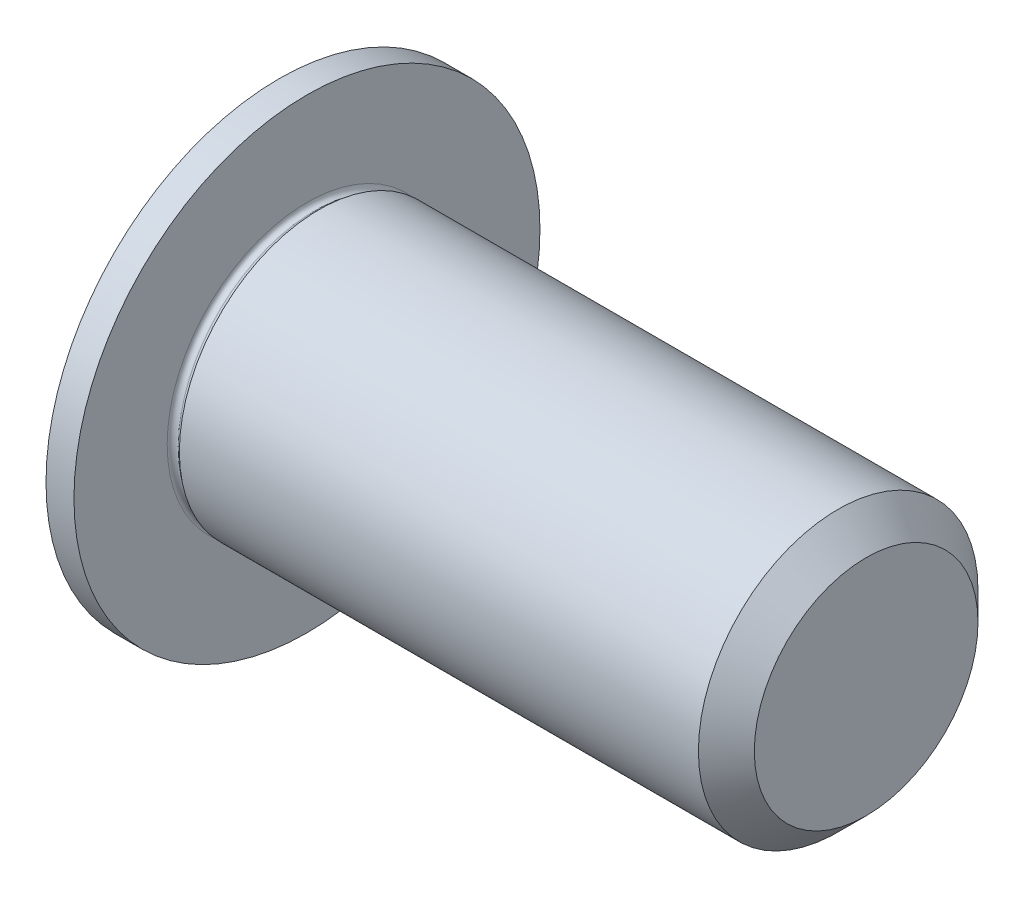
ISO-10303-21;
HEADER;
FILE_DESCRIPTION(('STEP AP214'),'2;1');
FILE_NAME('part.step','',(''),(''),'','','');
FILE_SCHEMA(('AUTOMOTIVE_DESIGN { 1 0 10303 214 1 1 1 1 }'));
ENDSEC;
DATA;
#1=APPLICATION_CONTEXT('core data for automotive mechanical design processes');
#2=APPLICATION_PROTOCOL_DEFINITION('international standard','automotive_design',2000,#1);
#3=PRODUCT_CONTEXT('',#1,'mechanical');
#4=PRODUCT('Part','Part','',(#3));
#5=PRODUCT_RELATED_PRODUCT_CATEGORY('part','',(#4));
#6=PRODUCT_DEFINITION_FORMATION('','',#4);
#7=PRODUCT_DEFINITION_CONTEXT('part definition',#1,'design');
#8=PRODUCT_DEFINITION('design','',#6,#7);
#9=PRODUCT_DEFINITION_SHAPE('','',#8);
#10=(LENGTH_UNIT() NAMED_UNIT(*) SI_UNIT(.MILLI.,.METRE.));
#11=(NAMED_UNIT(*) PLANE_ANGLE_UNIT() SI_UNIT($,.RADIAN.));
#12=(NAMED_UNIT(*) SI_UNIT($,.STERADIAN.) SOLID_ANGLE_UNIT());
#13=UNCERTAINTY_MEASURE_WITH_UNIT(LENGTH_MEASURE(1.E-05),#10,'distance_accuracy_value','');
#14=(GEOMETRIC_REPRESENTATION_CONTEXT(3) GLOBAL_UNCERTAINTY_ASSIGNED_CONTEXT((#13)) GLOBAL_UNIT_ASSIGNED_CONTEXT((#10,
#11,#12)) REPRESENTATION_CONTEXT('',''));
#15=CARTESIAN_POINT('',(0.,0.,0.));
#16=DIRECTION('',(0.,0.,1.));
#17=DIRECTION('',(1.,0.,0.));
#18=AXIS2_PLACEMENT_3D('',#15,#16,#17);
#19=CARTESIAN_POINT('',(0.,0.,0.));
#20=DIRECTION('',(1.,0.,0.));
#21=DIRECTION('',(0.,0.,-1.));
#22=AXIS2_PLACEMENT_3D('',#19,#20,#21);
#23=PLANE('',#22);
#24=CARTESIAN_POINT('',(0.,0.,0.));
#25=DIRECTION('',(1.,0.,0.));
#26=DIRECTION('',(0.,0.,-1.));
#27=AXIS2_PLACEMENT_3D('',#24,#25,#26);
#28=CIRCLE('',#27,2.4);
#29=CARTESIAN_POINT('',(0.,0.,-2.4));
#30=VERTEX_POINT('',#29);
#31=EDGE_CURVE('E62',#30,#30,#28,.T.);
#32=ORIENTED_EDGE('',*,*,#31,.T.);
#33=EDGE_LOOP('',(#32));
#34=FACE_BOUND('',#33,.T.);
#35=ADVANCED_FACE('F51',(#34),#23,.T.);
#36=CARTESIAN_POINT('',(0.,0.,0.));
#37=DIRECTION('',(1.,0.,0.));
#38=DIRECTION('',(0.,0.,-1.));
#39=AXIS2_PLACEMENT_3D('',#36,#37,#38);
#40=CYLINDRICAL_SURFACE('',#39,3.);
#41=CARTESIAN_POINT('',(-0.600000000000001,0.,0.));
#42=DIRECTION('',(1.,0.,0.));
#43=DIRECTION('',(0.,0.,-1.));
#44=AXIS2_PLACEMENT_3D('',#41,#42,#43);
#45=CIRCLE('',#44,3.);
#46=CARTESIAN_POINT('',(-0.600000000000001,0.,-3.));
#47=VERTEX_POINT('',#46);
#48=EDGE_CURVE('E12',#47,#47,#45,.F.);
#49=ORIENTED_EDGE('',*,*,#48,.T.);
#50=EDGE_LOOP('',(#49));
#51=FACE_BOUND('',#50,.T.);
#52=CARTESIAN_POINT('',(-11.738196601125,0.,0.));
#53=DIRECTION('',(1.,0.,0.));
#54=DIRECTION('',(0.,0.,-1.));
#55=AXIS2_PLACEMENT_3D('',#52,#53,#54);
#56=CIRCLE('',#55,3.);
#57=CARTESIAN_POINT('',(-11.738196601125,0.,-3.));
#58=VERTEX_POINT('',#57);
#59=EDGE_CURVE('E187',#58,#58,#56,.T.);
#60=ORIENTED_EDGE('',*,*,#59,.T.);
#61=EDGE_LOOP('',(#60));
#62=FACE_BOUND('',#61,.T.);
#63=ADVANCED_FACE('F263',(#51,#62),#40,.T.);
#64=CARTESIAN_POINT('',(-11.738196601125,0.,0.));
#65=DIRECTION('',(1.,0.,0.));
#66=DIRECTION('',(0.,0.,-1.));
#67=AXIS2_PLACEMENT_3D('',#64,#65,#66);
#68=CONICAL_SURFACE('',#67,3.,0.666239432492519);
#69=CARTESIAN_POINT('',(-11.838196601125,0.,0.));
#70=DIRECTION('',(1.,0.,0.));
#71=DIRECTION('',(0.,0.,-1.));
#72=AXIS2_PLACEMENT_3D('',#69,#70,#71);
#73=CIRCLE('',#72,2.92138486222425);
#74=CARTESIAN_POINT('',(-11.838196601125,0.,-2.92138486222425));
#75=VERTEX_POINT('',#74);
#76=EDGE_CURVE('E183',#75,#75,#73,.T.);
#77=ORIENTED_EDGE('',*,*,#76,.T.);
#78=EDGE_LOOP('',(#77));
#79=FACE_BOUND('',#78,.T.);
#80=ORIENTED_EDGE('',*,*,#59,.F.);
#81=EDGE_LOOP('',(#80));
#82=FACE_BOUND('',#81,.T.);
#83=ADVANCED_FACE('F267',(#79,#82),#68,.T.);
#84=CARTESIAN_POINT('',(-11.9,0.,0.));
#85=DIRECTION('',(1.,0.,0.));
#86=DIRECTION('',(0.,0.,-1.));
#87=AXIS2_PLACEMENT_3D('',#84,#85,#86);
#88=TOROIDAL_SURFACE('',#87,3.,0.0999999999999997);
#89=CARTESIAN_POINT('',(-12.,0.,0.));
#90=DIRECTION('',(1.,0.,0.));
#91=DIRECTION('',(0.,0.,-1.));
#92=AXIS2_PLACEMENT_3D('',#89,#90,#91);
#93=CIRCLE('',#92,3.);
#94=CARTESIAN_POINT('',(-12.,0.,-3.));
#95=VERTEX_POINT('',#94);
#96=EDGE_CURVE('E179',#95,#95,#93,.T.);
#97=ORIENTED_EDGE('',*,*,#96,.T.);
#98=EDGE_LOOP('',(#97));
#99=FACE_BOUND('',#98,.T.);
#100=ORIENTED_EDGE('',*,*,#76,.F.);
#101=EDGE_LOOP('',(#100));
#102=FACE_BOUND('',#101,.T.);
#103=ADVANCED_FACE('F273',(#99,#102),#88,.F.);
#104=CARTESIAN_POINT('',(-12.,3.,0.));
#105=DIRECTION('',(1.,0.,0.));
#106=DIRECTION('',(0.,0.,-1.));
#107=AXIS2_PLACEMENT_3D('',#104,#105,#106);
#108=PLANE('',#107);
#109=CARTESIAN_POINT('',(-12.,0.,0.));
#110=DIRECTION('',(1.,0.,0.));
#111=DIRECTION('',(0.,0.,-1.));
#112=AXIS2_PLACEMENT_3D('',#109,#110,#111);
#113=CIRCLE('',#112,5.);
#114=CARTESIAN_POINT('',(-12.,0.,-5.));
#115=VERTEX_POINT('',#114);
#116=EDGE_CURVE('E175',#115,#115,#113,.T.);
#117=ORIENTED_EDGE('',*,*,#116,.T.);
#118=EDGE_LOOP('',(#117));
#119=FACE_BOUND('',#118,.T.);
#120=ORIENTED_EDGE('',*,*,#96,.F.);
#121=EDGE_LOOP('',(#120));
#122=FACE_BOUND('',#121,.T.);
#123=ADVANCED_FACE('F277',(#119,#122),#108,.T.);
#124=CARTESIAN_POINT('',(0.,0.,0.));
#125=DIRECTION('',(1.,0.,0.));
#126=DIRECTION('',(0.,0.,-1.));
#127=AXIS2_PLACEMENT_3D('',#124,#125,#126);
#128=CYLINDRICAL_SURFACE('',#127,5.);
#129=CARTESIAN_POINT('',(-12.6,0.,0.));
#130=DIRECTION('',(1.,0.,0.));
#131=DIRECTION('',(0.,0.,-1.));
#132=AXIS2_PLACEMENT_3D('',#129,#130,#131);
#133=CIRCLE('',#132,5.);
#134=CARTESIAN_POINT('',(-12.6,0.,-5.));
#135=VERTEX_POINT('',#134);
#136=EDGE_CURVE('E171',#135,#135,#133,.T.);
#137=ORIENTED_EDGE('',*,*,#136,.T.);
#138=EDGE_LOOP('',(#137));
#139=FACE_BOUND('',#138,.T.);
#140=ORIENTED_EDGE('',*,*,#116,.F.);
#141=EDGE_LOOP('',(#140));
#142=FACE_BOUND('',#141,.T.);
#143=ADVANCED_FACE('F281',(#139,#142),#128,.T.);
#144=CARTESIAN_POINT('',(-12.6,0.,0.));
#145=DIRECTION('',(1.,0.,0.));
#146=DIRECTION('',(0.,0.,-1.));
#147=AXIS2_PLACEMENT_3D('',#144,#145,#146);
#148=CONICAL_SURFACE('',#147,5.,1.22173047639603);
#149=CARTESIAN_POINT('',(-13.2,0.,0.));
#150=DIRECTION('',(1.,0.,0.));
#151=DIRECTION('',(0.,0.,-1.));
#152=AXIS2_PLACEMENT_3D('',#149,#150,#151);
#153=CIRCLE('',#152,3.35151354832723);
#154=CARTESIAN_POINT('',(-13.2,0.,-3.35151354832723));
#155=VERTEX_POINT('',#154);
#156=EDGE_CURVE('E130',#155,#155,#153,.T.);
#157=ORIENTED_EDGE('',*,*,#156,.T.);
#158=EDGE_LOOP('',(#157));
#159=FACE_BOUND('',#158,.T.);
#160=ORIENTED_EDGE('',*,*,#136,.F.);
#161=EDGE_LOOP('',(#160));
#162=FACE_BOUND('',#161,.T.);
#163=ADVANCED_FACE('F285',(#159,#162),#148,.T.);
#164=CARTESIAN_POINT('',(-13.2,3.35151354832723,0.));
#165=DIRECTION('',(-1.,0.,0.));
#166=DIRECTION('',(0.,0.,1.));
#167=AXIS2_PLACEMENT_3D('',#164,#165,#166);
#168=PLANE('',#167);
#169=DIRECTION('',(0.,0.5,-0.866025403784439));
#170=VECTOR('',#169,1.);
#171=CARTESIAN_POINT('',(-13.2,0.866025403784439,1.5));
#172=LINE('',#171,#170);
#173=CARTESIAN_POINT('',(-13.2,0.866025403784439,1.5));
#174=VERTEX_POINT('',#173);
#175=CARTESIAN_POINT('',(-13.2,1.73205080756888,0.));
#176=VERTEX_POINT('',#175);
#177=EDGE_CURVE('E71',#174,#176,#172,.T.);
#178=ORIENTED_EDGE('',*,*,#177,.F.);
#179=DIRECTION('',(0.,1.,0.));
#180=VECTOR('',#179,1.);
#181=CARTESIAN_POINT('',(-13.2,-0.86602540378444,1.5));
#182=LINE('',#181,#180);
#183=CARTESIAN_POINT('',(-13.2,-0.86602540378444,1.5));
#184=VERTEX_POINT('',#183);
#185=EDGE_CURVE('E133',#184,#174,#182,.T.);
#186=ORIENTED_EDGE('',*,*,#185,.F.);
#187=DIRECTION('',(0.,0.5,0.866025403784439));
#188=VECTOR('',#187,1.);
#189=CARTESIAN_POINT('',(-13.2,-1.73205080756888,0.));
#190=LINE('',#189,#188);
#191=CARTESIAN_POINT('',(-13.2,-1.73205080756888,0.));
#192=VERTEX_POINT('',#191);
#193=EDGE_CURVE('E138',#192,#184,#190,.T.);
#194=ORIENTED_EDGE('',*,*,#193,.F.);
#195=DIRECTION('',(0.,-0.5,0.866025403784438));
#196=VECTOR('',#195,1.);
#197=CARTESIAN_POINT('',(-13.2,-0.866025403784439,-1.5));
#198=LINE('',#197,#196);
#199=CARTESIAN_POINT('',(-13.2,-0.866025403784439,-1.5));
#200=VERTEX_POINT('',#199);
#201=EDGE_CURVE('E162',#200,#192,#198,.T.);
#202=ORIENTED_EDGE('',*,*,#201,.F.);
#203=DIRECTION('',(0.,-1.,0.));
#204=VECTOR('',#203,1.);
#205=CARTESIAN_POINT('',(-13.2,0.866025403784439,-1.5));
#206=LINE('',#205,#204);
#207=CARTESIAN_POINT('',(-13.2,0.866025403784439,-1.5));
#208=VERTEX_POINT('',#207);
#209=EDGE_CURVE('E152',#208,#200,#206,.T.);
#210=ORIENTED_EDGE('',*,*,#209,.F.);
#211=DIRECTION('',(0.,-0.5,-0.866025403784439));
#212=VECTOR('',#211,1.);
#213=CARTESIAN_POINT('',(-13.2,1.73205080756888,0.));
#214=LINE('',#213,#212);
#215=EDGE_CURVE('E145',#176,#208,#214,.T.);
#216=ORIENTED_EDGE('',*,*,#215,.F.);
#217=EDGE_LOOP('',(#178,#186,#194,#202,#210,#216));
#218=FACE_BOUND('',#217,.T.);
#219=ORIENTED_EDGE('',*,*,#156,.F.);
#220=EDGE_LOOP('',(#219));
#221=FACE_BOUND('',#220,.T.);
#222=ADVANCED_FACE('F141',(#218,#221),#168,.T.);
#223=CARTESIAN_POINT('',(-9.2,0.866025403784439,1.5));
#224=DIRECTION('',(0.,0.866025403784439,0.5));
#225=DIRECTION('',(0.,-0.5,0.866025403784439));
#226=AXIS2_PLACEMENT_3D('',#223,#224,#225);
#227=PLANE('',#226);
#228=ORIENTED_EDGE('',*,*,#177,.T.);
#229=DIRECTION('',(-1.,0.,0.));
#230=VECTOR('',#229,1.);
#231=CARTESIAN_POINT('',(-9.2,1.73205080756888,0.));
#232=LINE('',#231,#230);
#233=CARTESIAN_POINT('',(-9.2,1.73205080756888,0.));
#234=VERTEX_POINT('',#233);
#235=EDGE_CURVE('E195',#234,#176,#232,.T.);
#236=ORIENTED_EDGE('',*,*,#235,.F.);
#237=DIRECTION('',(0.,-0.5,0.866025403784439));
#238=VECTOR('',#237,1.);
#239=CARTESIAN_POINT('',(-9.2,1.73205080756888,0.));
#240=LINE('',#239,#238);
#241=CARTESIAN_POINT('',(-9.2,0.866025403784439,1.5));
#242=VERTEX_POINT('',#241);
#243=EDGE_CURVE('E55',#242,#234,#240,.F.);
#244=ORIENTED_EDGE('',*,*,#243,.F.);
#245=DIRECTION('',(-1.,0.,0.));
#246=VECTOR('',#245,1.);
#247=CARTESIAN_POINT('',(-9.2,0.866025403784439,1.5));
#248=LINE('',#247,#246);
#249=EDGE_CURVE('E127',#242,#174,#248,.T.);
#250=ORIENTED_EDGE('',*,*,#249,.T.);
#251=EDGE_LOOP('',(#228,#236,#244,#250));
#252=FACE_BOUND('',#251,.T.);
#253=ADVANCED_FACE('F128',(#252),#227,.F.);
#254=CARTESIAN_POINT('',(-9.2,-0.86602540378444,1.5));
#255=DIRECTION('',(0.,0.,1.));
#256=DIRECTION('',(1.,0.,0.));
#257=AXIS2_PLACEMENT_3D('',#254,#255,#256);
#258=PLANE('',#257);
#259=ORIENTED_EDGE('',*,*,#185,.T.);
#260=ORIENTED_EDGE('',*,*,#249,.F.);
#261=DIRECTION('',(0.,1.,0.));
#262=VECTOR('',#261,1.);
#263=CARTESIAN_POINT('',(-9.2,0.,1.5));
#264=LINE('',#263,#262);
#265=CARTESIAN_POINT('',(-9.2,-0.866025403784439,1.5));
#266=VERTEX_POINT('',#265);
#267=EDGE_CURVE('E95',#266,#242,#264,.T.);
#268=ORIENTED_EDGE('',*,*,#267,.F.);
#269=DIRECTION('',(-1.,0.,0.));
#270=VECTOR('',#269,1.);
#271=CARTESIAN_POINT('',(-9.2,-0.86602540378444,1.5));
#272=LINE('',#271,#270);
#273=EDGE_CURVE('E123',#266,#184,#272,.T.);
#274=ORIENTED_EDGE('',*,*,#273,.T.);
#275=EDGE_LOOP('',(#259,#260,#268,#274));
#276=FACE_BOUND('',#275,.T.);
#277=ADVANCED_FACE('F134',(#276),#258,.F.);
#278=CARTESIAN_POINT('',(-9.2,-1.73205080756888,0.));
#279=DIRECTION('',(0.,-0.866025403784439,0.5));
#280=DIRECTION('',(0.,-0.5,-0.866025403784439));
#281=AXIS2_PLACEMENT_3D('',#278,#279,#280);
#282=PLANE('',#281);
#283=ORIENTED_EDGE('',*,*,#193,.T.);
#284=ORIENTED_EDGE('',*,*,#273,.F.);
#285=DIRECTION('',(0.,-0.5,-0.866025403784439));
#286=VECTOR('',#285,1.);
#287=CARTESIAN_POINT('',(-9.2,-0.866025403784439,1.5));
#288=LINE('',#287,#286);
#289=CARTESIAN_POINT('',(-9.2,-1.73205080756888,0.));
#290=VERTEX_POINT('',#289);
#291=EDGE_CURVE('E208',#290,#266,#288,.F.);
#292=ORIENTED_EDGE('',*,*,#291,.F.);
#293=DIRECTION('',(-1.,0.,0.));
#294=VECTOR('',#293,1.);
#295=CARTESIAN_POINT('',(-9.2,-1.73205080756888,0.));
#296=LINE('',#295,#294);
#297=EDGE_CURVE('E193',#290,#192,#296,.T.);
#298=ORIENTED_EDGE('',*,*,#297,.T.);
#299=EDGE_LOOP('',(#283,#284,#292,#298));
#300=FACE_BOUND('',#299,.T.);
#301=ADVANCED_FACE('F254',(#300),#282,.F.);
#302=CARTESIAN_POINT('',(-9.2,-0.866025403784439,-1.5));
#303=DIRECTION('',(0.,-0.866025403784439,-0.5));
#304=DIRECTION('',(0.,0.5,-0.866025403784439));
#305=AXIS2_PLACEMENT_3D('',#302,#303,#304);
#306=PLANE('',#305);
#307=ORIENTED_EDGE('',*,*,#201,.T.);
#308=ORIENTED_EDGE('',*,*,#297,.F.);
#309=DIRECTION('',(0.,0.5,-0.866025403784439));
#310=VECTOR('',#309,1.);
#311=CARTESIAN_POINT('',(-9.2,-1.73205080756888,0.));
#312=LINE('',#311,#310);
#313=CARTESIAN_POINT('',(-9.2,-0.866025403784439,-1.5));
#314=VERTEX_POINT('',#313);
#315=EDGE_CURVE('E211',#314,#290,#312,.F.);
#316=ORIENTED_EDGE('',*,*,#315,.F.);
#317=DIRECTION('',(-1.,0.,0.));
#318=VECTOR('',#317,1.);
#319=CARTESIAN_POINT('',(-9.2,-0.866025403784439,-1.5));
#320=LINE('',#319,#318);
#321=EDGE_CURVE('E201',#314,#200,#320,.T.);
#322=ORIENTED_EDGE('',*,*,#321,.T.);
#323=EDGE_LOOP('',(#307,#308,#316,#322));
#324=FACE_BOUND('',#323,.T.);
#325=ADVANCED_FACE('F251',(#324),#306,.F.);
#326=CARTESIAN_POINT('',(-9.2,0.866025403784439,-1.5));
#327=DIRECTION('',(0.,0.,-1.));
#328=DIRECTION('',(0.,1.,0.));
#329=AXIS2_PLACEMENT_3D('',#326,#327,#328);
#330=PLANE('',#329);
#331=ORIENTED_EDGE('',*,*,#209,.T.);
#332=ORIENTED_EDGE('',*,*,#321,.F.);
#333=DIRECTION('',(0.,1.,0.));
#334=VECTOR('',#333,1.);
#335=CARTESIAN_POINT('',(-9.2,0.,-1.5));
#336=LINE('',#335,#334);
#337=CARTESIAN_POINT('',(-9.2,0.866025403784439,-1.5));
#338=VERTEX_POINT('',#337);
#339=EDGE_CURVE('E214',#338,#314,#336,.F.);
#340=ORIENTED_EDGE('',*,*,#339,.F.);
#341=DIRECTION('',(-1.,0.,0.));
#342=VECTOR('',#341,1.);
#343=CARTESIAN_POINT('',(-9.2,0.866025403784439,-1.5));
#344=LINE('',#343,#342);
#345=EDGE_CURVE('E198',#338,#208,#344,.T.);
#346=ORIENTED_EDGE('',*,*,#345,.T.);
#347=EDGE_LOOP('',(#331,#332,#340,#346));
#348=FACE_BOUND('',#347,.T.);
#349=ADVANCED_FACE('F230',(#348),#330,.F.);
#350=CARTESIAN_POINT('',(-9.2,1.73205080756888,0.));
#351=DIRECTION('',(0.,0.866025403784439,-0.5));
#352=DIRECTION('',(0.,0.5,0.866025403784439));
#353=AXIS2_PLACEMENT_3D('',#350,#351,#352);
#354=PLANE('',#353);
#355=ORIENTED_EDGE('',*,*,#215,.T.);
#356=ORIENTED_EDGE('',*,*,#345,.F.);
#357=DIRECTION('',(0.,0.5,0.866025403784439));
#358=VECTOR('',#357,1.);
#359=CARTESIAN_POINT('',(-9.2,0.866025403784439,-1.5));
#360=LINE('',#359,#358);
#361=EDGE_CURVE('E217',#234,#338,#360,.F.);
#362=ORIENTED_EDGE('',*,*,#361,.F.);
#363=ORIENTED_EDGE('',*,*,#235,.T.);
#364=EDGE_LOOP('',(#355,#356,#362,#363));
#365=FACE_BOUND('',#364,.T.);
#366=ADVANCED_FACE('F226',(#365),#354,.F.);
#367=CARTESIAN_POINT('',(0.,0.,0.));
#368=DIRECTION('',(-1.,0.,0.));
#369=DIRECTION('',(0.,0.,1.));
#370=AXIS2_PLACEMENT_3D('',#367,#368,#369);
#371=CONICAL_SURFACE('',#370,2.4,0.785398163397446);
#372=ORIENTED_EDGE('',*,*,#48,.F.);
#373=EDGE_LOOP('',(#372));
#374=FACE_BOUND('',#373,.T.);
#375=ORIENTED_EDGE('',*,*,#31,.F.);
#376=EDGE_LOOP('',(#375));
#377=FACE_BOUND('',#376,.T.);
#378=ADVANCED_FACE('F53',(#374,#377),#371,.T.);
#379=CARTESIAN_POINT('',(-8.55769230769231,-1.48223578724644,-0.85576923076923));
#380=DIRECTION('',(-0.98058067569092,-0.169841555121689,-0.098058067569092));
#381=DIRECTION('',(0.170664037196572,-0.985329278164293,0.));
#382=AXIS2_PLACEMENT_3D('',#379,#380,#381);
#383=PLANE('',#382);
#384=DIRECTION('',(-0.170664037196572,0.985329278164293,0.));
#385=VECTOR('',#384,1.);
#386=CARTESIAN_POINT('',(-8.9,0.,0.));
#387=LINE('',#386,#385);
#388=CARTESIAN_POINT('',(-8.9,0.,0.));
#389=VERTEX_POINT('',#388);
#390=EDGE_CURVE('E105',#389,#234,#387,.T.);
#391=ORIENTED_EDGE('',*,*,#390,.F.);
#392=DIRECTION('',(-0.170664037196572,0.492664639082147,0.853320185982861));
#393=VECTOR('',#392,1.);
#394=CARTESIAN_POINT('',(-8.9,0.,0.));
#395=LINE('',#394,#393);
#396=EDGE_CURVE('E147',#389,#242,#395,.T.);
#397=ORIENTED_EDGE('',*,*,#396,.T.);
#398=ORIENTED_EDGE('',*,*,#243,.T.);
#399=EDGE_LOOP('',(#391,#397,#398));
#400=FACE_BOUND('',#399,.T.);
#401=ADVANCED_FACE('F224',(#400),#383,.T.);
#402=CARTESIAN_POINT('',(-8.55769230769231,0.,-1.71153846153846));
#403=DIRECTION('',(-0.98058067569092,0.,-0.196116135138184));
#404=DIRECTION('',(-0.196116135138184,0.,0.98058067569092));
#405=AXIS2_PLACEMENT_3D('',#402,#403,#404);
#406=PLANE('',#405);
#407=ORIENTED_EDGE('',*,*,#396,.F.);
#408=DIRECTION('',(-0.170664037196572,-0.492664639082147,0.853320185982861));
#409=VECTOR('',#408,1.);
#410=CARTESIAN_POINT('',(-8.9,0.,0.));
#411=LINE('',#410,#409);
#412=EDGE_CURVE('E242',#389,#266,#411,.T.);
#413=ORIENTED_EDGE('',*,*,#412,.T.);
#414=ORIENTED_EDGE('',*,*,#267,.T.);
#415=EDGE_LOOP('',(#407,#413,#414));
#416=FACE_BOUND('',#415,.T.);
#417=ADVANCED_FACE('F314',(#416),#406,.T.);
#418=CARTESIAN_POINT('',(-8.55769230769231,-1.48223578724644,0.85576923076923));
#419=DIRECTION('',(-0.98058067569092,-0.169841555121689,0.098058067569092));
#420=DIRECTION('',(0.170664037196572,-0.985329278164293,0.));
#421=AXIS2_PLACEMENT_3D('',#418,#419,#420);
#422=PLANE('',#421);
#423=DIRECTION('',(-0.170664037196572,0.492664639082147,-0.853320185982861));
#424=VECTOR('',#423,1.);
#425=CARTESIAN_POINT('',(-8.9,0.,0.));
#426=LINE('',#425,#424);
#427=EDGE_CURVE('E235',#389,#338,#426,.T.);
#428=ORIENTED_EDGE('',*,*,#427,.F.);
#429=ORIENTED_EDGE('',*,*,#390,.T.);
#430=ORIENTED_EDGE('',*,*,#361,.T.);
#431=EDGE_LOOP('',(#428,#429,#430));
#432=FACE_BOUND('',#431,.T.);
#433=ADVANCED_FACE('F320',(#432),#422,.T.);
#434=CARTESIAN_POINT('',(-8.55769230769231,0.,1.71153846153846));
#435=DIRECTION('',(-0.98058067569092,0.,0.196116135138184));
#436=DIRECTION('',(0.196116135138184,0.,0.98058067569092));
#437=AXIS2_PLACEMENT_3D('',#434,#435,#436);
#438=PLANE('',#437);
#439=DIRECTION('',(-0.170664037196572,-0.492664639082147,-0.853320185982861));
#440=VECTOR('',#439,1.);
#441=CARTESIAN_POINT('',(-8.9,0.,0.));
#442=LINE('',#441,#440);
#443=EDGE_CURVE('E234',#389,#314,#442,.T.);
#444=ORIENTED_EDGE('',*,*,#443,.F.);
#445=ORIENTED_EDGE('',*,*,#427,.T.);
#446=ORIENTED_EDGE('',*,*,#339,.T.);
#447=EDGE_LOOP('',(#444,#445,#446));
#448=FACE_BOUND('',#447,.T.);
#449=ADVANCED_FACE('F233',(#448),#438,.T.);
#450=CARTESIAN_POINT('',(-8.55769230769231,1.48223578724644,0.855769230769231));
#451=DIRECTION('',(-0.98058067569092,0.169841555121689,0.098058067569092));
#452=DIRECTION('',(-0.170664037196572,-0.985329278164293,0.));
#453=AXIS2_PLACEMENT_3D('',#450,#451,#452);
#454=PLANE('',#453);
#455=DIRECTION('',(-0.170664037196572,-0.985329278164293,0.));
#456=VECTOR('',#455,1.);
#457=CARTESIAN_POINT('',(-8.9,0.,0.));
#458=LINE('',#457,#456);
#459=EDGE_CURVE('E111',#389,#290,#458,.T.);
#460=ORIENTED_EDGE('',*,*,#459,.F.);
#461=ORIENTED_EDGE('',*,*,#443,.T.);
#462=ORIENTED_EDGE('',*,*,#315,.T.);
#463=EDGE_LOOP('',(#460,#461,#462));
#464=FACE_BOUND('',#463,.T.);
#465=ADVANCED_FACE('F249',(#464),#454,.T.);
#466=CARTESIAN_POINT('',(-8.55769230769231,1.48223578724644,-0.85576923076923));
#467=DIRECTION('',(-0.98058067569092,0.169841555121689,-0.0980580675690919));
#468=DIRECTION('',(-0.170664037196572,-0.985329278164293,0.));
#469=AXIS2_PLACEMENT_3D('',#466,#467,#468);
#470=PLANE('',#469);
#471=ORIENTED_EDGE('',*,*,#412,.F.);
#472=ORIENTED_EDGE('',*,*,#459,.T.);
#473=ORIENTED_EDGE('',*,*,#291,.T.);
#474=EDGE_LOOP('',(#471,#472,#473));
#475=FACE_BOUND('',#474,.T.);
#476=ADVANCED_FACE('F246',(#475),#470,.T.);
#477=CLOSED_SHELL('',(#35,#63,#83,#103,#123,#143,#163,#222,#253,#277,#301,#325,#349,#366,#378,
#401,#417,#433,#449,#465,#476));
#478=MANIFOLD_SOLID_BREP('B2',#477);
#479=ADVANCED_BREP_SHAPE_REPRESENTATION('',(#18,#478),#14);
#480=SHAPE_DEFINITION_REPRESENTATION(#9,#479);
ENDSEC;
END-ISO-10303-21;
